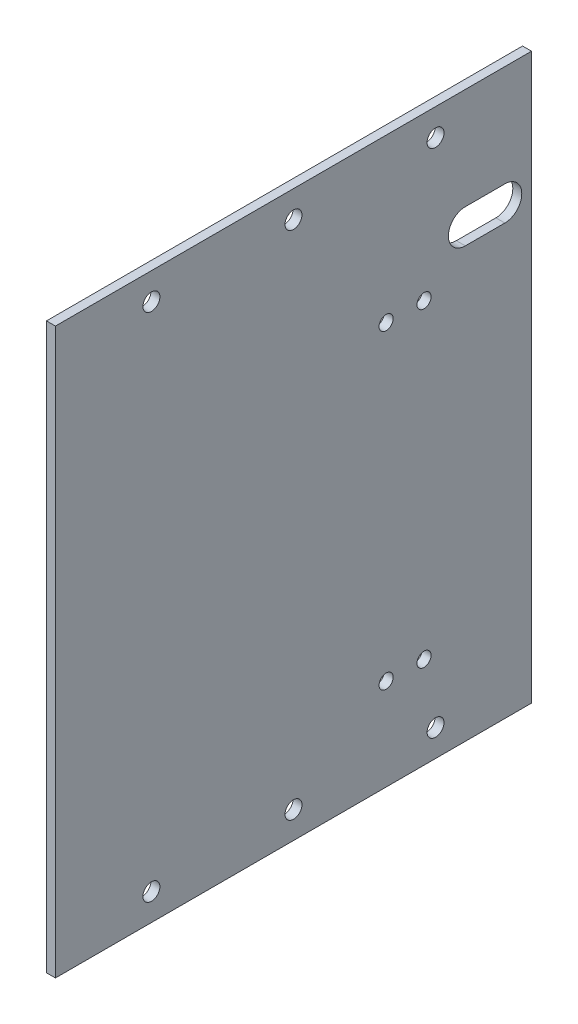
ISO-10303-21;
HEADER;
FILE_DESCRIPTION(('STEP AP214'),'2;1');
FILE_NAME('part.step','',(''),(''),'','','');
FILE_SCHEMA(('AUTOMOTIVE_DESIGN { 1 0 10303 214 1 1 1 1 }'));
ENDSEC;
DATA;
#1=APPLICATION_CONTEXT('core data for automotive mechanical design processes');
#2=APPLICATION_PROTOCOL_DEFINITION('international standard','automotive_design',2000,#1);
#3=PRODUCT_CONTEXT('',#1,'mechanical');
#4=PRODUCT('Part','Part','',(#3));
#5=PRODUCT_RELATED_PRODUCT_CATEGORY('part','',(#4));
#6=PRODUCT_DEFINITION_FORMATION('','',#4);
#7=PRODUCT_DEFINITION_CONTEXT('part definition',#1,'design');
#8=PRODUCT_DEFINITION('design','',#6,#7);
#9=PRODUCT_DEFINITION_SHAPE('','',#8);
#10=(LENGTH_UNIT() NAMED_UNIT(*) SI_UNIT(.MILLI.,.METRE.));
#11=(NAMED_UNIT(*) PLANE_ANGLE_UNIT() SI_UNIT($,.RADIAN.));
#12=(NAMED_UNIT(*) SI_UNIT($,.STERADIAN.) SOLID_ANGLE_UNIT());
#13=UNCERTAINTY_MEASURE_WITH_UNIT(LENGTH_MEASURE(1.E-05),#10,'distance_accuracy_value','');
#14=(GEOMETRIC_REPRESENTATION_CONTEXT(3) GLOBAL_UNCERTAINTY_ASSIGNED_CONTEXT((#13)) GLOBAL_UNIT_ASSIGNED_CONTEXT((#10,
#11,#12)) REPRESENTATION_CONTEXT('',''));
#15=CARTESIAN_POINT('',(0.,0.,0.));
#16=DIRECTION('',(0.,0.,1.));
#17=DIRECTION('',(1.,0.,0.));
#18=AXIS2_PLACEMENT_3D('',#15,#16,#17);
#19=CARTESIAN_POINT('',(112.60685789838,59.525,-77.8015837190426));
#20=DIRECTION('',(1.,0.,0.));
#21=DIRECTION('',(0.,0.,-1.));
#22=AXIS2_PLACEMENT_3D('',#19,#20,#21);
#23=PLANE('',#22);
#24=CARTESIAN_POINT('',(112.60685789838,80.775,-100.922868006973));
#25=DIRECTION('',(-1.,0.,0.));
#26=DIRECTION('',(0.,0.,1.));
#27=AXIS2_PLACEMENT_3D('',#24,#25,#26);
#28=CIRCLE('',#27,1.25);
#29=CARTESIAN_POINT('',(112.60685789838,80.775,-99.672868006973));
#30=VERTEX_POINT('',#29);
#31=EDGE_CURVE('E20',#30,#30,#28,.T.);
#32=ORIENTED_EDGE('',*,*,#31,.T.);
#33=EDGE_LOOP('',(#32));
#34=FACE_BOUND('',#33,.T.);
#35=CARTESIAN_POINT('',(112.60685789838,80.775,-94.2097466396054));
#36=DIRECTION('',(-1.,0.,0.));
#37=DIRECTION('',(0.,0.,1.));
#38=AXIS2_PLACEMENT_3D('',#35,#36,#37);
#39=CIRCLE('',#38,1.25);
#40=CARTESIAN_POINT('',(112.60685789838,80.775,-92.9597466396054));
#41=VERTEX_POINT('',#40);
#42=EDGE_CURVE('E177',#41,#41,#39,.T.);
#43=ORIENTED_EDGE('',*,*,#42,.T.);
#44=EDGE_LOOP('',(#43));
#45=FACE_BOUND('',#44,.T.);
#46=CARTESIAN_POINT('',(112.60685789838,25.775,-94.2097466396054));
#47=DIRECTION('',(-1.,0.,0.));
#48=DIRECTION('',(0.,0.,1.));
#49=AXIS2_PLACEMENT_3D('',#46,#47,#48);
#50=CIRCLE('',#49,1.25);
#51=CARTESIAN_POINT('',(112.60685789838,25.775,-92.9597466396054));
#52=VERTEX_POINT('',#51);
#53=EDGE_CURVE('E112',#52,#52,#50,.T.);
#54=ORIENTED_EDGE('',*,*,#53,.T.);
#55=EDGE_LOOP('',(#54));
#56=FACE_BOUND('',#55,.T.);
#57=CARTESIAN_POINT('',(112.60685789838,88.5297637553018,-108.234871450156));
#58=DIRECTION('',(-1.,0.,0.));
#59=DIRECTION('',(0.,0.,1.));
#60=AXIS2_PLACEMENT_3D('',#57,#58,#59);
#61=CIRCLE('',#60,2.9999999999999);
#62=CARTESIAN_POINT('',(112.60685789838,85.5297637553019,-108.234871450156));
#63=VERTEX_POINT('',#62);
#64=CARTESIAN_POINT('',(112.60685789838,91.5297637553017,-108.234871450156));
#65=VERTEX_POINT('',#64);
#66=EDGE_CURVE('E174',#63,#65,#61,.T.);
#67=ORIENTED_EDGE('',*,*,#66,.T.);
#68=DIRECTION('',(0.,0.,1.));
#69=VECTOR('',#68,1.);
#70=CARTESIAN_POINT('',(112.60685789838,91.5297637553017,-108.234871450156));
#71=LINE('',#70,#69);
#72=CARTESIAN_POINT('',(112.60685789838,91.5297637553012,-115.234871450157));
#73=VERTEX_POINT('',#72);
#74=EDGE_CURVE('E113',#65,#73,#71,.F.);
#75=ORIENTED_EDGE('',*,*,#74,.T.);
#76=CARTESIAN_POINT('',(112.60685789838,88.5297637553012,-115.234871450156));
#77=DIRECTION('',(-1.,0.,0.));
#78=DIRECTION('',(0.,0.,1.));
#79=AXIS2_PLACEMENT_3D('',#76,#77,#78);
#80=CIRCLE('',#79,3.00000000000001);
#81=CARTESIAN_POINT('',(112.60685789838,85.5297637553012,-115.234871450156));
#82=VERTEX_POINT('',#81);
#83=EDGE_CURVE('E172',#73,#82,#80,.T.);
#84=ORIENTED_EDGE('',*,*,#83,.T.);
#85=DIRECTION('',(0.,0.,-1.));
#86=VECTOR('',#85,1.);
#87=CARTESIAN_POINT('',(112.60685789838,85.5297637553012,-115.234871450156));
#88=LINE('',#87,#86);
#89=EDGE_CURVE('E62',#82,#63,#88,.F.);
#90=ORIENTED_EDGE('',*,*,#89,.T.);
#91=EDGE_LOOP('',(#67,#75,#84,#90));
#92=FACE_BOUND('',#91,.T.);
#93=CARTESIAN_POINT('',(112.60685789838,25.775,-100.922868006973));
#94=DIRECTION('',(-1.,0.,0.));
#95=DIRECTION('',(0.,0.,1.));
#96=AXIS2_PLACEMENT_3D('',#93,#94,#95);
#97=CIRCLE('',#96,1.25);
#98=CARTESIAN_POINT('',(112.60685789838,25.775,-99.672868006973));
#99=VERTEX_POINT('',#98);
#100=EDGE_CURVE('E168',#99,#99,#97,.T.);
#101=ORIENTED_EDGE('',*,*,#100,.T.);
#102=EDGE_LOOP('',(#101));
#103=FACE_BOUND('',#102,.T.);
#104=CARTESIAN_POINT('',(112.60685789838,14.2875,-52.6390837190426));
#105=DIRECTION('',(-1.,0.,0.));
#106=DIRECTION('',(0.,0.,1.));
#107=AXIS2_PLACEMENT_3D('',#104,#105,#106);
#108=CIRCLE('',#107,1.5);
#109=CARTESIAN_POINT('',(112.60685789838,14.2875,-51.1390837190426));
#110=VERTEX_POINT('',#109);
#111=EDGE_CURVE('E165',#110,#110,#108,.T.);
#112=ORIENTED_EDGE('',*,*,#111,.T.);
#113=EDGE_LOOP('',(#112));
#114=FACE_BOUND('',#113,.T.);
#115=CARTESIAN_POINT('',(112.60685789838,104.7625,-52.6390837190426));
#116=DIRECTION('',(-1.,0.,0.));
#117=DIRECTION('',(0.,0.,1.));
#118=AXIS2_PLACEMENT_3D('',#115,#116,#117);
#119=CIRCLE('',#118,1.5);
#120=CARTESIAN_POINT('',(112.60685789838,104.7625,-51.1390837190426));
#121=VERTEX_POINT('',#120);
#122=EDGE_CURVE('E162',#121,#121,#119,.T.);
#123=ORIENTED_EDGE('',*,*,#122,.T.);
#124=EDGE_LOOP('',(#123));
#125=FACE_BOUND('',#124,.T.);
#126=CARTESIAN_POINT('',(112.60685789838,14.2875,-77.8015837190426));
#127=DIRECTION('',(-1.,0.,0.));
#128=DIRECTION('',(0.,0.,1.));
#129=AXIS2_PLACEMENT_3D('',#126,#127,#128);
#130=CIRCLE('',#129,1.5);
#131=CARTESIAN_POINT('',(112.60685789838,14.2875,-76.3015837190426));
#132=VERTEX_POINT('',#131);
#133=EDGE_CURVE('E159',#132,#132,#130,.T.);
#134=ORIENTED_EDGE('',*,*,#133,.T.);
#135=EDGE_LOOP('',(#134));
#136=FACE_BOUND('',#135,.T.);
#137=CARTESIAN_POINT('',(112.60685789838,104.7625,-102.964083719043));
#138=DIRECTION('',(-1.,0.,0.));
#139=DIRECTION('',(0.,0.,1.));
#140=AXIS2_PLACEMENT_3D('',#137,#138,#139);
#141=CIRCLE('',#140,1.5);
#142=CARTESIAN_POINT('',(112.60685789838,104.7625,-101.464083719043));
#143=VERTEX_POINT('',#142);
#144=EDGE_CURVE('E156',#143,#143,#141,.T.);
#145=ORIENTED_EDGE('',*,*,#144,.T.);
#146=EDGE_LOOP('',(#145));
#147=FACE_BOUND('',#146,.T.);
#148=CARTESIAN_POINT('',(112.60685789838,104.7625,-77.8015837190426));
#149=DIRECTION('',(-1.,0.,0.));
#150=DIRECTION('',(0.,0.,1.));
#151=AXIS2_PLACEMENT_3D('',#148,#149,#150);
#152=CIRCLE('',#151,1.5);
#153=CARTESIAN_POINT('',(112.60685789838,104.7625,-76.3015837190426));
#154=VERTEX_POINT('',#153);
#155=EDGE_CURVE('E153',#154,#154,#152,.T.);
#156=ORIENTED_EDGE('',*,*,#155,.T.);
#157=EDGE_LOOP('',(#156));
#158=FACE_BOUND('',#157,.T.);
#159=CARTESIAN_POINT('',(112.60685789838,14.2875,-102.964083719043));
#160=DIRECTION('',(-1.,0.,0.));
#161=DIRECTION('',(0.,0.,1.));
#162=AXIS2_PLACEMENT_3D('',#159,#160,#161);
#163=CIRCLE('',#162,1.5);
#164=CARTESIAN_POINT('',(112.60685789838,14.2875,-101.464083719043));
#165=VERTEX_POINT('',#164);
#166=EDGE_CURVE('E150',#165,#165,#163,.T.);
#167=ORIENTED_EDGE('',*,*,#166,.T.);
#168=EDGE_LOOP('',(#167));
#169=FACE_BOUND('',#168,.T.);
#170=DIRECTION('',(0.,0.,-1.));
#171=VECTOR('',#170,1.);
#172=CARTESIAN_POINT('',(112.60685789838,9.525,-35.6390837190426));
#173=LINE('',#172,#171);
#174=CARTESIAN_POINT('',(112.60685789838,9.52500000000001,-119.964083719043));
#175=VERTEX_POINT('',#174);
#176=CARTESIAN_POINT('',(112.60685789838,9.52500000000001,-35.6390837190426));
#177=VERTEX_POINT('',#176);
#178=EDGE_CURVE('E99',#175,#177,#173,.F.);
#179=ORIENTED_EDGE('',*,*,#178,.F.);
#180=DIRECTION('',(0.,1.,0.));
#181=VECTOR('',#180,1.);
#182=CARTESIAN_POINT('',(112.60685789838,9.525,-119.964083719043));
#183=LINE('',#182,#181);
#184=CARTESIAN_POINT('',(112.60685789838,109.525,-119.964083719043));
#185=VERTEX_POINT('',#184);
#186=EDGE_CURVE('E89',#185,#175,#183,.F.);
#187=ORIENTED_EDGE('',*,*,#186,.F.);
#188=DIRECTION('',(0.,0.,1.));
#189=VECTOR('',#188,1.);
#190=CARTESIAN_POINT('',(112.60685789838,109.525,-119.964083719043));
#191=LINE('',#190,#189);
#192=CARTESIAN_POINT('',(112.60685789838,109.525,-35.6390837190426));
#193=VERTEX_POINT('',#192);
#194=EDGE_CURVE('E83',#193,#185,#191,.F.);
#195=ORIENTED_EDGE('',*,*,#194,.F.);
#196=DIRECTION('',(0.,1.,0.));
#197=VECTOR('',#196,1.);
#198=CARTESIAN_POINT('',(112.60685789838,109.525,-35.6390837190426));
#199=LINE('',#198,#197);
#200=EDGE_CURVE('E71',#177,#193,#199,.T.);
#201=ORIENTED_EDGE('',*,*,#200,.F.);
#202=EDGE_LOOP('',(#179,#187,#195,#201));
#203=FACE_BOUND('',#202,.T.);
#204=ADVANCED_FACE('F17',(#34,#45,#56,#92,#103,#114,#125,#136,#147,#158,#169,#203),#23,.T.);
#205=CARTESIAN_POINT('',(111.01935789838,9.525,-35.6390837190426));
#206=DIRECTION('',(0.,-1.,0.));
#207=DIRECTION('',(0.,0.,-1.));
#208=AXIS2_PLACEMENT_3D('',#205,#206,#207);
#209=PLANE('',#208);
#210=ORIENTED_EDGE('',*,*,#178,.T.);
#211=DIRECTION('',(1.,0.,0.));
#212=VECTOR('',#211,1.);
#213=CARTESIAN_POINT('',(111.01935789838,9.52500000000001,-35.6390837190426));
#214=LINE('',#213,#212);
#215=CARTESIAN_POINT('',(111.01935789838,9.52500000000001,-35.6390837190426));
#216=VERTEX_POINT('',#215);
#217=EDGE_CURVE('E188',#216,#177,#214,.T.);
#218=ORIENTED_EDGE('',*,*,#217,.F.);
#219=DIRECTION('',(0.,0.,-1.));
#220=VECTOR('',#219,1.);
#221=CARTESIAN_POINT('',(111.01935789838,9.52500000000001,-77.8015837190426));
#222=LINE('',#221,#220);
#223=CARTESIAN_POINT('',(111.01935789838,9.52500000000001,-119.964083719043));
#224=VERTEX_POINT('',#223);
#225=EDGE_CURVE('E106',#216,#224,#222,.T.);
#226=ORIENTED_EDGE('',*,*,#225,.T.);
#227=DIRECTION('',(-1.,0.,0.));
#228=VECTOR('',#227,1.);
#229=CARTESIAN_POINT('',(111.01935789838,9.52500000000001,-119.964083719043));
#230=LINE('',#229,#228);
#231=EDGE_CURVE('E94',#175,#224,#230,.T.);
#232=ORIENTED_EDGE('',*,*,#231,.F.);
#233=EDGE_LOOP('',(#210,#218,#226,#232));
#234=FACE_BOUND('',#233,.T.);
#235=ADVANCED_FACE('F104',(#234),#209,.T.);
#236=CARTESIAN_POINT('',(111.01935789838,9.525,-119.964083719043));
#237=DIRECTION('',(0.,0.,-1.));
#238=DIRECTION('',(-1.,0.,0.));
#239=AXIS2_PLACEMENT_3D('',#236,#237,#238);
#240=PLANE('',#239);
#241=DIRECTION('',(1.,0.,0.));
#242=VECTOR('',#241,1.);
#243=CARTESIAN_POINT('',(111.01935789838,109.525,-119.964083719043));
#244=LINE('',#243,#242);
#245=CARTESIAN_POINT('',(111.01935789838,109.525,-119.964083719043));
#246=VERTEX_POINT('',#245);
#247=EDGE_CURVE('E96',#185,#246,#244,.F.);
#248=ORIENTED_EDGE('',*,*,#247,.F.);
#249=ORIENTED_EDGE('',*,*,#186,.T.);
#250=ORIENTED_EDGE('',*,*,#231,.T.);
#251=DIRECTION('',(0.,1.,0.));
#252=VECTOR('',#251,1.);
#253=CARTESIAN_POINT('',(111.01935789838,59.525,-119.964083719043));
#254=LINE('',#253,#252);
#255=EDGE_CURVE('E202',#224,#246,#254,.T.);
#256=ORIENTED_EDGE('',*,*,#255,.T.);
#257=EDGE_LOOP('',(#248,#249,#250,#256));
#258=FACE_BOUND('',#257,.T.);
#259=ADVANCED_FACE('F91',(#258),#240,.T.);
#260=CARTESIAN_POINT('',(111.01935789838,109.525,-119.964083719043));
#261=DIRECTION('',(0.,1.,0.));
#262=DIRECTION('',(0.,0.,1.));
#263=AXIS2_PLACEMENT_3D('',#260,#261,#262);
#264=PLANE('',#263);
#265=ORIENTED_EDGE('',*,*,#194,.T.);
#266=ORIENTED_EDGE('',*,*,#247,.T.);
#267=DIRECTION('',(0.,0.,-1.));
#268=VECTOR('',#267,1.);
#269=CARTESIAN_POINT('',(111.01935789838,109.525,-77.8015837190426));
#270=LINE('',#269,#268);
#271=CARTESIAN_POINT('',(111.01935789838,109.525,-35.6390837190426));
#272=VERTEX_POINT('',#271);
#273=EDGE_CURVE('E198',#246,#272,#270,.F.);
#274=ORIENTED_EDGE('',*,*,#273,.T.);
#275=DIRECTION('',(1.,0.,0.));
#276=VECTOR('',#275,1.);
#277=CARTESIAN_POINT('',(111.01935789838,109.525,-35.6390837190426));
#278=LINE('',#277,#276);
#279=EDGE_CURVE('E182',#193,#272,#278,.F.);
#280=ORIENTED_EDGE('',*,*,#279,.F.);
#281=EDGE_LOOP('',(#265,#266,#274,#280));
#282=FACE_BOUND('',#281,.T.);
#283=ADVANCED_FACE('F197',(#282),#264,.T.);
#284=CARTESIAN_POINT('',(111.01935789838,109.525,-35.6390837190426));
#285=DIRECTION('',(0.,0.,1.));
#286=DIRECTION('',(1.,0.,0.));
#287=AXIS2_PLACEMENT_3D('',#284,#285,#286);
#288=PLANE('',#287);
#289=ORIENTED_EDGE('',*,*,#200,.T.);
#290=ORIENTED_EDGE('',*,*,#279,.T.);
#291=DIRECTION('',(0.,1.,0.));
#292=VECTOR('',#291,1.);
#293=CARTESIAN_POINT('',(111.01935789838,59.525,-35.6390837190426));
#294=LINE('',#293,#292);
#295=EDGE_CURVE('E149',#272,#216,#294,.F.);
#296=ORIENTED_EDGE('',*,*,#295,.T.);
#297=ORIENTED_EDGE('',*,*,#217,.T.);
#298=EDGE_LOOP('',(#289,#290,#296,#297));
#299=FACE_BOUND('',#298,.T.);
#300=ADVANCED_FACE('F225',(#299),#288,.T.);
#301=CARTESIAN_POINT('',(112.60685789838,80.775,-100.922868006973));
#302=DIRECTION('',(-1.,0.,0.));
#303=DIRECTION('',(0.,0.,1.));
#304=AXIS2_PLACEMENT_3D('',#301,#302,#303);
#305=CYLINDRICAL_SURFACE('',#304,1.25);
#306=ORIENTED_EDGE('',*,*,#31,.F.);
#307=EDGE_LOOP('',(#306));
#308=FACE_BOUND('',#307,.T.);
#309=CARTESIAN_POINT('',(111.01935789838,80.775,-100.922868006973));
#310=DIRECTION('',(-1.,0.,0.));
#311=DIRECTION('',(0.,0.,1.));
#312=AXIS2_PLACEMENT_3D('',#309,#310,#311);
#313=CIRCLE('',#312,1.25);
#314=CARTESIAN_POINT('',(111.01935789838,80.775,-99.672868006973));
#315=VERTEX_POINT('',#314);
#316=EDGE_CURVE('E146',#315,#315,#313,.T.);
#317=ORIENTED_EDGE('',*,*,#316,.T.);
#318=EDGE_LOOP('',(#317));
#319=FACE_BOUND('',#318,.T.);
#320=ADVANCED_FACE('F228',(#308,#319),#305,.F.);
#321=CARTESIAN_POINT('',(112.60685789838,80.775,-94.2097466396054));
#322=DIRECTION('',(-1.,0.,0.));
#323=DIRECTION('',(0.,0.,1.));
#324=AXIS2_PLACEMENT_3D('',#321,#322,#323);
#325=CYLINDRICAL_SURFACE('',#324,1.25);
#326=ORIENTED_EDGE('',*,*,#42,.F.);
#327=EDGE_LOOP('',(#326));
#328=FACE_BOUND('',#327,.T.);
#329=CARTESIAN_POINT('',(111.01935789838,80.775,-94.2097466396054));
#330=DIRECTION('',(-1.,0.,0.));
#331=DIRECTION('',(0.,0.,1.));
#332=AXIS2_PLACEMENT_3D('',#329,#330,#331);
#333=CIRCLE('',#332,1.25);
#334=CARTESIAN_POINT('',(111.01935789838,80.775,-92.9597466396054));
#335=VERTEX_POINT('',#334);
#336=EDGE_CURVE('E143',#335,#335,#333,.T.);
#337=ORIENTED_EDGE('',*,*,#336,.T.);
#338=EDGE_LOOP('',(#337));
#339=FACE_BOUND('',#338,.T.);
#340=ADVANCED_FACE('F235',(#328,#339),#325,.F.);
#341=CARTESIAN_POINT('',(112.60685789838,25.775,-94.2097466396054));
#342=DIRECTION('',(-1.,0.,0.));
#343=DIRECTION('',(0.,0.,1.));
#344=AXIS2_PLACEMENT_3D('',#341,#342,#343);
#345=CYLINDRICAL_SURFACE('',#344,1.25);
#346=ORIENTED_EDGE('',*,*,#53,.F.);
#347=EDGE_LOOP('',(#346));
#348=FACE_BOUND('',#347,.T.);
#349=CARTESIAN_POINT('',(111.01935789838,25.775,-94.2097466396054));
#350=DIRECTION('',(-1.,0.,0.));
#351=DIRECTION('',(0.,0.,1.));
#352=AXIS2_PLACEMENT_3D('',#349,#350,#351);
#353=CIRCLE('',#352,1.25);
#354=CARTESIAN_POINT('',(111.01935789838,25.775,-92.9597466396054));
#355=VERTEX_POINT('',#354);
#356=EDGE_CURVE('E140',#355,#355,#353,.T.);
#357=ORIENTED_EDGE('',*,*,#356,.T.);
#358=EDGE_LOOP('',(#357));
#359=FACE_BOUND('',#358,.T.);
#360=ADVANCED_FACE('F285',(#348,#359),#345,.F.);
#361=CARTESIAN_POINT('',(112.60685789838,85.5297637553012,-115.234871450156));
#362=DIRECTION('',(0.,-1.,0.));
#363=DIRECTION('',(0.,0.,-1.));
#364=AXIS2_PLACEMENT_3D('',#361,#362,#363);
#365=PLANE('',#364);
#366=DIRECTION('',(-1.,0.,0.));
#367=VECTOR('',#366,1.);
#368=CARTESIAN_POINT('',(112.60685789838,85.5297637553019,-108.234871450156));
#369=LINE('',#368,#367);
#370=CARTESIAN_POINT('',(111.01935789838,85.5297637553016,-108.234871450156));
#371=VERTEX_POINT('',#370);
#372=EDGE_CURVE('E111',#371,#63,#369,.F.);
#373=ORIENTED_EDGE('',*,*,#372,.T.);
#374=ORIENTED_EDGE('',*,*,#89,.F.);
#375=DIRECTION('',(-1.,0.,0.));
#376=VECTOR('',#375,1.);
#377=CARTESIAN_POINT('',(112.60685789838,85.5297637553012,-115.234871450156));
#378=LINE('',#377,#376);
#379=CARTESIAN_POINT('',(111.01935789838,85.5297637553012,-115.234871450156));
#380=VERTEX_POINT('',#379);
#381=EDGE_CURVE('E171',#82,#380,#378,.T.);
#382=ORIENTED_EDGE('',*,*,#381,.T.);
#383=DIRECTION('',(0.,0.,-1.));
#384=VECTOR('',#383,1.);
#385=CARTESIAN_POINT('',(111.01935789838,85.5297637553012,-77.8015837190426));
#386=LINE('',#385,#384);
#387=EDGE_CURVE('E139',#380,#371,#386,.F.);
#388=ORIENTED_EDGE('',*,*,#387,.T.);
#389=EDGE_LOOP('',(#373,#374,#382,#388));
#390=FACE_BOUND('',#389,.T.);
#391=ADVANCED_FACE('F282',(#390),#365,.F.);
#392=CARTESIAN_POINT('',(112.60685789838,88.5297637553018,-108.234871450156));
#393=DIRECTION('',(-1.,0.,0.));
#394=DIRECTION('',(0.,0.,1.));
#395=AXIS2_PLACEMENT_3D('',#392,#393,#394);
#396=CYLINDRICAL_SURFACE('',#395,2.9999999999999);
#397=DIRECTION('',(1.,0.,0.));
#398=VECTOR('',#397,1.);
#399=CARTESIAN_POINT('',(112.60685789838,91.5297637553017,-108.234871450156));
#400=LINE('',#399,#398);
#401=CARTESIAN_POINT('',(111.01935789838,91.5297637553017,-108.234871450156));
#402=VERTEX_POINT('',#401);
#403=EDGE_CURVE('E114',#402,#65,#400,.T.);
#404=ORIENTED_EDGE('',*,*,#403,.T.);
#405=ORIENTED_EDGE('',*,*,#66,.F.);
#406=ORIENTED_EDGE('',*,*,#372,.F.);
#407=CARTESIAN_POINT('',(111.01935789838,88.5297637553018,-108.234871450156));
#408=DIRECTION('',(-1.,0.,0.));
#409=DIRECTION('',(0.,0.,1.));
#410=AXIS2_PLACEMENT_3D('',#407,#408,#409);
#411=CIRCLE('',#410,2.9999999999999);
#412=EDGE_CURVE('E136',#371,#402,#411,.T.);
#413=ORIENTED_EDGE('',*,*,#412,.T.);
#414=EDGE_LOOP('',(#404,#405,#406,#413));
#415=FACE_BOUND('',#414,.T.);
#416=ADVANCED_FACE('F212',(#415),#396,.F.);
#417=CARTESIAN_POINT('',(112.60685789838,91.5297637553017,-108.234871450156));
#418=DIRECTION('',(0.,1.,0.));
#419=DIRECTION('',(0.,0.,1.));
#420=AXIS2_PLACEMENT_3D('',#417,#418,#419);
#421=PLANE('',#420);
#422=DIRECTION('',(-1.,0.,0.));
#423=VECTOR('',#422,1.);
#424=CARTESIAN_POINT('',(112.60685789838,91.5297637553012,-115.234871450157));
#425=LINE('',#424,#423);
#426=CARTESIAN_POINT('',(111.01935789838,91.5297637553015,-115.234871450157));
#427=VERTEX_POINT('',#426);
#428=EDGE_CURVE('E35',#427,#73,#425,.F.);
#429=ORIENTED_EDGE('',*,*,#428,.T.);
#430=ORIENTED_EDGE('',*,*,#74,.F.);
#431=ORIENTED_EDGE('',*,*,#403,.F.);
#432=DIRECTION('',(0.,0.,-1.));
#433=VECTOR('',#432,1.);
#434=CARTESIAN_POINT('',(111.01935789838,91.5297637553017,-77.8015837190426));
#435=LINE('',#434,#433);
#436=EDGE_CURVE('E135',#402,#427,#435,.T.);
#437=ORIENTED_EDGE('',*,*,#436,.T.);
#438=EDGE_LOOP('',(#429,#430,#431,#437));
#439=FACE_BOUND('',#438,.T.);
#440=ADVANCED_FACE('F219',(#439),#421,.F.);
#441=CARTESIAN_POINT('',(112.60685789838,88.5297637553012,-115.234871450156));
#442=DIRECTION('',(-1.,0.,0.));
#443=DIRECTION('',(0.,0.,1.));
#444=AXIS2_PLACEMENT_3D('',#441,#442,#443);
#445=CYLINDRICAL_SURFACE('',#444,3.00000000000001);
#446=ORIENTED_EDGE('',*,*,#381,.F.);
#447=ORIENTED_EDGE('',*,*,#83,.F.);
#448=ORIENTED_EDGE('',*,*,#428,.F.);
#449=CARTESIAN_POINT('',(111.01935789838,88.5297637553012,-115.234871450156));
#450=DIRECTION('',(-1.,0.,0.));
#451=DIRECTION('',(0.,0.,1.));
#452=AXIS2_PLACEMENT_3D('',#449,#450,#451);
#453=CIRCLE('',#452,3.00000000000001);
#454=EDGE_CURVE('E133',#427,#380,#453,.T.);
#455=ORIENTED_EDGE('',*,*,#454,.T.);
#456=EDGE_LOOP('',(#446,#447,#448,#455));
#457=FACE_BOUND('',#456,.T.);
#458=ADVANCED_FACE('F274',(#457),#445,.F.);
#459=CARTESIAN_POINT('',(112.60685789838,25.775,-100.922868006973));
#460=DIRECTION('',(-1.,0.,0.));
#461=DIRECTION('',(0.,0.,1.));
#462=AXIS2_PLACEMENT_3D('',#459,#460,#461);
#463=CYLINDRICAL_SURFACE('',#462,1.25);
#464=ORIENTED_EDGE('',*,*,#100,.F.);
#465=EDGE_LOOP('',(#464));
#466=FACE_BOUND('',#465,.T.);
#467=CARTESIAN_POINT('',(111.01935789838,25.775,-100.922868006973));
#468=DIRECTION('',(-1.,0.,0.));
#469=DIRECTION('',(0.,0.,1.));
#470=AXIS2_PLACEMENT_3D('',#467,#468,#469);
#471=CIRCLE('',#470,1.25);
#472=CARTESIAN_POINT('',(111.01935789838,25.775,-99.672868006973));
#473=VERTEX_POINT('',#472);
#474=EDGE_CURVE('E130',#473,#473,#471,.T.);
#475=ORIENTED_EDGE('',*,*,#474,.T.);
#476=EDGE_LOOP('',(#475));
#477=FACE_BOUND('',#476,.T.);
#478=ADVANCED_FACE('F270',(#466,#477),#463,.F.);
#479=CARTESIAN_POINT('',(112.60685789838,14.2875,-52.6390837190426));
#480=DIRECTION('',(-1.,0.,0.));
#481=DIRECTION('',(0.,0.,1.));
#482=AXIS2_PLACEMENT_3D('',#479,#480,#481);
#483=CYLINDRICAL_SURFACE('',#482,1.5);
#484=ORIENTED_EDGE('',*,*,#111,.F.);
#485=EDGE_LOOP('',(#484));
#486=FACE_BOUND('',#485,.T.);
#487=CARTESIAN_POINT('',(111.01935789838,14.2875,-52.6390837190426));
#488=DIRECTION('',(-1.,0.,0.));
#489=DIRECTION('',(0.,0.,1.));
#490=AXIS2_PLACEMENT_3D('',#487,#488,#489);
#491=CIRCLE('',#490,1.5);
#492=CARTESIAN_POINT('',(111.01935789838,14.2875,-51.1390837190426));
#493=VERTEX_POINT('',#492);
#494=EDGE_CURVE('E127',#493,#493,#491,.T.);
#495=ORIENTED_EDGE('',*,*,#494,.T.);
#496=EDGE_LOOP('',(#495));
#497=FACE_BOUND('',#496,.T.);
#498=ADVANCED_FACE('F266',(#486,#497),#483,.F.);
#499=CARTESIAN_POINT('',(112.60685789838,104.7625,-52.6390837190426));
#500=DIRECTION('',(-1.,0.,0.));
#501=DIRECTION('',(0.,0.,1.));
#502=AXIS2_PLACEMENT_3D('',#499,#500,#501);
#503=CYLINDRICAL_SURFACE('',#502,1.5);
#504=ORIENTED_EDGE('',*,*,#122,.F.);
#505=EDGE_LOOP('',(#504));
#506=FACE_BOUND('',#505,.T.);
#507=CARTESIAN_POINT('',(111.01935789838,104.7625,-52.6390837190426));
#508=DIRECTION('',(-1.,0.,0.));
#509=DIRECTION('',(0.,0.,1.));
#510=AXIS2_PLACEMENT_3D('',#507,#508,#509);
#511=CIRCLE('',#510,1.5);
#512=CARTESIAN_POINT('',(111.01935789838,104.7625,-51.1390837190426));
#513=VERTEX_POINT('',#512);
#514=EDGE_CURVE('E124',#513,#513,#511,.T.);
#515=ORIENTED_EDGE('',*,*,#514,.T.);
#516=EDGE_LOOP('',(#515));
#517=FACE_BOUND('',#516,.T.);
#518=ADVANCED_FACE('F262',(#506,#517),#503,.F.);
#519=CARTESIAN_POINT('',(112.60685789838,14.2875,-77.8015837190426));
#520=DIRECTION('',(-1.,0.,0.));
#521=DIRECTION('',(0.,0.,1.));
#522=AXIS2_PLACEMENT_3D('',#519,#520,#521);
#523=CYLINDRICAL_SURFACE('',#522,1.5);
#524=ORIENTED_EDGE('',*,*,#133,.F.);
#525=EDGE_LOOP('',(#524));
#526=FACE_BOUND('',#525,.T.);
#527=CARTESIAN_POINT('',(111.01935789838,14.2875,-77.8015837190426));
#528=DIRECTION('',(-1.,0.,0.));
#529=DIRECTION('',(0.,0.,1.));
#530=AXIS2_PLACEMENT_3D('',#527,#528,#529);
#531=CIRCLE('',#530,1.5);
#532=CARTESIAN_POINT('',(111.01935789838,14.2875,-76.3015837190426));
#533=VERTEX_POINT('',#532);
#534=EDGE_CURVE('E121',#533,#533,#531,.T.);
#535=ORIENTED_EDGE('',*,*,#534,.T.);
#536=EDGE_LOOP('',(#535));
#537=FACE_BOUND('',#536,.T.);
#538=ADVANCED_FACE('F258',(#526,#537),#523,.F.);
#539=CARTESIAN_POINT('',(112.60685789838,104.7625,-102.964083719043));
#540=DIRECTION('',(-1.,0.,0.));
#541=DIRECTION('',(0.,0.,1.));
#542=AXIS2_PLACEMENT_3D('',#539,#540,#541);
#543=CYLINDRICAL_SURFACE('',#542,1.5);
#544=ORIENTED_EDGE('',*,*,#144,.F.);
#545=EDGE_LOOP('',(#544));
#546=FACE_BOUND('',#545,.T.);
#547=CARTESIAN_POINT('',(111.01935789838,104.7625,-102.964083719043));
#548=DIRECTION('',(-1.,0.,0.));
#549=DIRECTION('',(0.,0.,1.));
#550=AXIS2_PLACEMENT_3D('',#547,#548,#549);
#551=CIRCLE('',#550,1.5);
#552=CARTESIAN_POINT('',(111.01935789838,104.7625,-101.464083719043));
#553=VERTEX_POINT('',#552);
#554=EDGE_CURVE('E118',#553,#553,#551,.T.);
#555=ORIENTED_EDGE('',*,*,#554,.T.);
#556=EDGE_LOOP('',(#555));
#557=FACE_BOUND('',#556,.T.);
#558=ADVANCED_FACE('F254',(#546,#557),#543,.F.);
#559=CARTESIAN_POINT('',(112.60685789838,104.7625,-77.8015837190426));
#560=DIRECTION('',(-1.,0.,0.));
#561=DIRECTION('',(0.,0.,1.));
#562=AXIS2_PLACEMENT_3D('',#559,#560,#561);
#563=CYLINDRICAL_SURFACE('',#562,1.5);
#564=ORIENTED_EDGE('',*,*,#155,.F.);
#565=EDGE_LOOP('',(#564));
#566=FACE_BOUND('',#565,.T.);
#567=CARTESIAN_POINT('',(111.01935789838,104.7625,-77.8015837190426));
#568=DIRECTION('',(-1.,0.,0.));
#569=DIRECTION('',(0.,0.,1.));
#570=AXIS2_PLACEMENT_3D('',#567,#568,#569);
#571=CIRCLE('',#570,1.5);
#572=CARTESIAN_POINT('',(111.01935789838,104.7625,-76.3015837190426));
#573=VERTEX_POINT('',#572);
#574=EDGE_CURVE('E26',#573,#573,#571,.T.);
#575=ORIENTED_EDGE('',*,*,#574,.T.);
#576=EDGE_LOOP('',(#575));
#577=FACE_BOUND('',#576,.T.);
#578=ADVANCED_FACE('F246',(#566,#577),#563,.F.);
#579=CARTESIAN_POINT('',(112.60685789838,14.2875,-102.964083719043));
#580=DIRECTION('',(-1.,0.,0.));
#581=DIRECTION('',(0.,0.,1.));
#582=AXIS2_PLACEMENT_3D('',#579,#580,#581);
#583=CYLINDRICAL_SURFACE('',#582,1.5);
#584=ORIENTED_EDGE('',*,*,#166,.F.);
#585=EDGE_LOOP('',(#584));
#586=FACE_BOUND('',#585,.T.);
#587=CARTESIAN_POINT('',(111.01935789838,14.2875,-102.964083719043));
#588=DIRECTION('',(-1.,0.,0.));
#589=DIRECTION('',(0.,0.,1.));
#590=AXIS2_PLACEMENT_3D('',#587,#588,#589);
#591=CIRCLE('',#590,1.5);
#592=CARTESIAN_POINT('',(111.01935789838,14.2875,-101.464083719043));
#593=VERTEX_POINT('',#592);
#594=EDGE_CURVE('E11',#593,#593,#591,.T.);
#595=ORIENTED_EDGE('',*,*,#594,.T.);
#596=EDGE_LOOP('',(#595));
#597=FACE_BOUND('',#596,.T.);
#598=ADVANCED_FACE('F240',(#586,#597),#583,.F.);
#599=CARTESIAN_POINT('',(111.01935789838,59.525,-77.8015837190426));
#600=DIRECTION('',(1.,0.,0.));
#601=DIRECTION('',(0.,0.,-1.));
#602=AXIS2_PLACEMENT_3D('',#599,#600,#601);
#603=PLANE('',#602);
#604=ORIENTED_EDGE('',*,*,#594,.F.);
#605=EDGE_LOOP('',(#604));
#606=FACE_BOUND('',#605,.T.);
#607=ORIENTED_EDGE('',*,*,#574,.F.);
#608=EDGE_LOOP('',(#607));
#609=FACE_BOUND('',#608,.T.);
#610=ORIENTED_EDGE('',*,*,#554,.F.);
#611=EDGE_LOOP('',(#610));
#612=FACE_BOUND('',#611,.T.);
#613=ORIENTED_EDGE('',*,*,#534,.F.);
#614=EDGE_LOOP('',(#613));
#615=FACE_BOUND('',#614,.T.);
#616=ORIENTED_EDGE('',*,*,#514,.F.);
#617=EDGE_LOOP('',(#616));
#618=FACE_BOUND('',#617,.T.);
#619=ORIENTED_EDGE('',*,*,#494,.F.);
#620=EDGE_LOOP('',(#619));
#621=FACE_BOUND('',#620,.T.);
#622=ORIENTED_EDGE('',*,*,#474,.F.);
#623=EDGE_LOOP('',(#622));
#624=FACE_BOUND('',#623,.T.);
#625=ORIENTED_EDGE('',*,*,#436,.F.);
#626=ORIENTED_EDGE('',*,*,#412,.F.);
#627=ORIENTED_EDGE('',*,*,#387,.F.);
#628=ORIENTED_EDGE('',*,*,#454,.F.);
#629=EDGE_LOOP('',(#625,#626,#627,#628));
#630=FACE_BOUND('',#629,.T.);
#631=ORIENTED_EDGE('',*,*,#356,.F.);
#632=EDGE_LOOP('',(#631));
#633=FACE_BOUND('',#632,.T.);
#634=ORIENTED_EDGE('',*,*,#336,.F.);
#635=EDGE_LOOP('',(#634));
#636=FACE_BOUND('',#635,.T.);
#637=ORIENTED_EDGE('',*,*,#316,.F.);
#638=EDGE_LOOP('',(#637));
#639=FACE_BOUND('',#638,.T.);
#640=ORIENTED_EDGE('',*,*,#273,.F.);
#641=ORIENTED_EDGE('',*,*,#255,.F.);
#642=ORIENTED_EDGE('',*,*,#225,.F.);
#643=ORIENTED_EDGE('',*,*,#295,.F.);
#644=EDGE_LOOP('',(#640,#641,#642,#643));
#645=FACE_BOUND('',#644,.T.);
#646=ADVANCED_FACE('F201',(#606,#609,#612,#615,#618,#621,#624,#630,#633,#636,#639,#645),#603,.F.);
#647=CLOSED_SHELL('',(#204,#235,#259,#283,#300,#320,#340,#360,#391,#416,#440,#458,#478,#498,
#518,#538,#558,#578,#598,#646));
#648=MANIFOLD_SOLID_BREP('B1',#647);
#649=ADVANCED_BREP_SHAPE_REPRESENTATION('',(#18,#648),#14);
#650=SHAPE_DEFINITION_REPRESENTATION(#9,#649);
ENDSEC;
END-ISO-10303-21;
